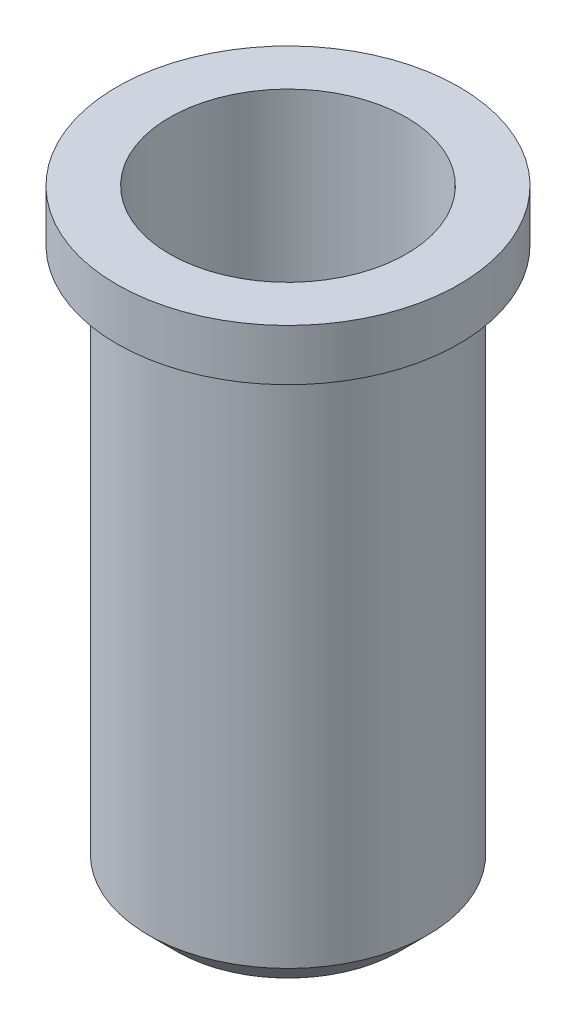
ISO-10303-21;
HEADER;
FILE_DESCRIPTION(('STEP AP214'),'2;1');
FILE_NAME('part.step','',(''),(''),'','','');
FILE_SCHEMA(('AUTOMOTIVE_DESIGN { 1 0 10303 214 1 1 1 1 }'));
ENDSEC;
DATA;
#1=APPLICATION_CONTEXT('core data for automotive mechanical design processes');
#2=APPLICATION_PROTOCOL_DEFINITION('international standard','automotive_design',2000,#1);
#3=PRODUCT_CONTEXT('',#1,'mechanical');
#4=PRODUCT('Part','Part','',(#3));
#5=PRODUCT_RELATED_PRODUCT_CATEGORY('part','',(#4));
#6=PRODUCT_DEFINITION_FORMATION('','',#4);
#7=PRODUCT_DEFINITION_CONTEXT('part definition',#1,'design');
#8=PRODUCT_DEFINITION('design','',#6,#7);
#9=PRODUCT_DEFINITION_SHAPE('','',#8);
#10=(LENGTH_UNIT() NAMED_UNIT(*) SI_UNIT(.MILLI.,.METRE.));
#11=(NAMED_UNIT(*) PLANE_ANGLE_UNIT() SI_UNIT($,.RADIAN.));
#12=(NAMED_UNIT(*) SI_UNIT($,.STERADIAN.) SOLID_ANGLE_UNIT());
#13=UNCERTAINTY_MEASURE_WITH_UNIT(LENGTH_MEASURE(1.E-05),#10,'distance_accuracy_value','');
#14=(GEOMETRIC_REPRESENTATION_CONTEXT(3) GLOBAL_UNCERTAINTY_ASSIGNED_CONTEXT((#13)) GLOBAL_UNIT_ASSIGNED_CONTEXT((#10,
#11,#12)) REPRESENTATION_CONTEXT('',''));
#15=CARTESIAN_POINT('',(0.,0.,0.));
#16=DIRECTION('',(0.,0.,1.));
#17=DIRECTION('',(1.,0.,0.));
#18=AXIS2_PLACEMENT_3D('',#15,#16,#17);
#19=CARTESIAN_POINT('',(0.,0.,0.));
#20=DIRECTION('',(0.,-1.,0.));
#21=DIRECTION('',(0.,0.,-1.));
#22=AXIS2_PLACEMENT_3D('',#19,#20,#21);
#23=CYLINDRICAL_SURFACE('',#22,1.0541);
#24=CARTESIAN_POINT('',(0.,0.8382,0.));
#25=DIRECTION('',(0.,-1.,0.));
#26=DIRECTION('',(0.,0.,-1.));
#27=AXIS2_PLACEMENT_3D('',#24,#25,#26);
#28=CIRCLE('',#27,1.0541);
#29=CARTESIAN_POINT('',(0.,0.8382,-1.0541));
#30=VERTEX_POINT('',#29);
#31=EDGE_CURVE('E11',#30,#30,#28,.T.);
#32=ORIENTED_EDGE('',*,*,#31,.T.);
#33=EDGE_LOOP('',(#32));
#34=FACE_BOUND('',#33,.T.);
#35=CARTESIAN_POINT('',(0.,5.4102,0.));
#36=DIRECTION('',(0.,-1.,0.));
#37=DIRECTION('',(0.,0.,-1.));
#38=AXIS2_PLACEMENT_3D('',#35,#36,#37);
#39=CIRCLE('',#38,1.0541);
#40=CARTESIAN_POINT('',(0.,5.4102,-1.0541));
#41=VERTEX_POINT('',#40);
#42=EDGE_CURVE('E53',#41,#41,#39,.T.);
#43=ORIENTED_EDGE('',*,*,#42,.F.);
#44=EDGE_LOOP('',(#43));
#45=FACE_BOUND('',#44,.T.);
#46=ADVANCED_FACE('F34',(#34,#45),#23,.F.);
#47=CARTESIAN_POINT('',(0.,0.8382,0.));
#48=DIRECTION('',(0.,1.,0.));
#49=DIRECTION('',(0.,0.,1.));
#50=AXIS2_PLACEMENT_3D('',#47,#48,#49);
#51=CONICAL_SURFACE('',#50,1.0541,1.06472136349856);
#52=CARTESIAN_POINT('',(0.,0.254,0.));
#53=VERTEX_POINT('',#52);
#54=VERTEX_LOOP('',#53);
#55=FACE_BOUND('',#54,.T.);
#56=ORIENTED_EDGE('',*,*,#31,.F.);
#57=EDGE_LOOP('',(#56));
#58=FACE_BOUND('',#57,.T.);
#59=ADVANCED_FACE('F43',(#55,#58),#51,.F.);
#60=CARTESIAN_POINT('',(0.,0.,0.));
#61=DIRECTION('',(0.,-1.,0.));
#62=DIRECTION('',(0.,0.,-1.));
#63=AXIS2_PLACEMENT_3D('',#60,#61,#62);
#64=PLANE('',#63);
#65=CARTESIAN_POINT('',(0.,0.,0.));
#66=DIRECTION('',(0.,-1.,0.));
#67=DIRECTION('',(0.,0.,-1.));
#68=AXIS2_PLACEMENT_3D('',#65,#66,#67);
#69=CIRCLE('',#68,0.9906);
#70=CARTESIAN_POINT('',(0.,0.,-0.9906));
#71=VERTEX_POINT('',#70);
#72=EDGE_CURVE('E40',#71,#71,#69,.T.);
#73=ORIENTED_EDGE('',*,*,#72,.T.);
#74=EDGE_LOOP('',(#73));
#75=FACE_BOUND('',#74,.T.);
#76=ADVANCED_FACE('F46',(#75),#64,.T.);
#77=CARTESIAN_POINT('',(0.,0.254,0.));
#78=DIRECTION('',(0.,1.,0.));
#79=DIRECTION('',(0.,0.,1.));
#80=AXIS2_PLACEMENT_3D('',#77,#78,#79);
#81=CONICAL_SURFACE('',#80,1.2446,0.785398163397449);
#82=ORIENTED_EDGE('',*,*,#72,.F.);
#83=EDGE_LOOP('',(#82));
#84=FACE_BOUND('',#83,.T.);
#85=CARTESIAN_POINT('',(0.,0.254,0.));
#86=DIRECTION('',(0.,-1.,0.));
#87=DIRECTION('',(0.,0.,-1.));
#88=AXIS2_PLACEMENT_3D('',#85,#86,#87);
#89=CIRCLE('',#88,1.2446);
#90=CARTESIAN_POINT('',(0.,0.254,-1.2446));
#91=VERTEX_POINT('',#90);
#92=EDGE_CURVE('E66',#91,#91,#89,.T.);
#93=ORIENTED_EDGE('',*,*,#92,.T.);
#94=EDGE_LOOP('',(#93));
#95=FACE_BOUND('',#94,.T.);
#96=ADVANCED_FACE('F72',(#84,#95),#81,.T.);
#97=CARTESIAN_POINT('',(0.,0.,0.));
#98=DIRECTION('',(0.,-1.,0.));
#99=DIRECTION('',(0.,0.,-1.));
#100=AXIS2_PLACEMENT_3D('',#97,#98,#99);
#101=CYLINDRICAL_SURFACE('',#100,1.2446);
#102=CARTESIAN_POINT('',(0.,4.953,0.));
#103=DIRECTION('',(0.,-1.,0.));
#104=DIRECTION('',(0.,0.,-1.));
#105=AXIS2_PLACEMENT_3D('',#102,#103,#104);
#106=CIRCLE('',#105,1.2446);
#107=CARTESIAN_POINT('',(0.,4.953,-1.2446));
#108=VERTEX_POINT('',#107);
#109=EDGE_CURVE('E63',#108,#108,#106,.T.);
#110=ORIENTED_EDGE('',*,*,#109,.T.);
#111=EDGE_LOOP('',(#110));
#112=FACE_BOUND('',#111,.T.);
#113=ORIENTED_EDGE('',*,*,#92,.F.);
#114=EDGE_LOOP('',(#113));
#115=FACE_BOUND('',#114,.T.);
#116=ADVANCED_FACE('F75',(#112,#115),#101,.T.);
#117=CARTESIAN_POINT('',(0.,4.953,0.));
#118=DIRECTION('',(0.,-1.,0.));
#119=DIRECTION('',(0.,0.,-1.));
#120=AXIS2_PLACEMENT_3D('',#117,#118,#119);
#121=PLANE('',#120);
#122=CARTESIAN_POINT('',(0.,4.953,0.));
#123=DIRECTION('',(0.,-1.,0.));
#124=DIRECTION('',(0.,0.,-1.));
#125=AXIS2_PLACEMENT_3D('',#122,#123,#124);
#126=CIRCLE('',#125,1.524);
#127=CARTESIAN_POINT('',(0.,4.953,-1.524));
#128=VERTEX_POINT('',#127);
#129=EDGE_CURVE('E58',#128,#128,#126,.T.);
#130=ORIENTED_EDGE('',*,*,#129,.T.);
#131=EDGE_LOOP('',(#130));
#132=FACE_BOUND('',#131,.T.);
#133=ORIENTED_EDGE('',*,*,#109,.F.);
#134=EDGE_LOOP('',(#133));
#135=FACE_BOUND('',#134,.T.);
#136=ADVANCED_FACE('F80',(#132,#135),#121,.T.);
#137=CARTESIAN_POINT('',(0.,0.,0.));
#138=DIRECTION('',(0.,-1.,0.));
#139=DIRECTION('',(0.,0.,-1.));
#140=AXIS2_PLACEMENT_3D('',#137,#138,#139);
#141=CYLINDRICAL_SURFACE('',#140,1.524);
#142=ORIENTED_EDGE('',*,*,#129,.F.);
#143=EDGE_LOOP('',(#142));
#144=FACE_BOUND('',#143,.T.);
#145=CARTESIAN_POINT('',(0.,5.4102,0.));
#146=DIRECTION('',(0.,-1.,0.));
#147=DIRECTION('',(0.,0.,-1.));
#148=AXIS2_PLACEMENT_3D('',#145,#146,#147);
#149=CIRCLE('',#148,1.524);
#150=CARTESIAN_POINT('',(0.,5.4102,-1.524));
#151=VERTEX_POINT('',#150);
#152=EDGE_CURVE('E55',#151,#151,#149,.T.);
#153=ORIENTED_EDGE('',*,*,#152,.T.);
#154=EDGE_LOOP('',(#153));
#155=FACE_BOUND('',#154,.T.);
#156=ADVANCED_FACE('F86',(#144,#155),#141,.T.);
#157=CARTESIAN_POINT('',(0.,5.4102,0.));
#158=DIRECTION('',(0.,-1.,0.));
#159=DIRECTION('',(0.,0.,-1.));
#160=AXIS2_PLACEMENT_3D('',#157,#158,#159);
#161=PLANE('',#160);
#162=ORIENTED_EDGE('',*,*,#152,.F.);
#163=EDGE_LOOP('',(#162));
#164=FACE_BOUND('',#163,.T.);
#165=ORIENTED_EDGE('',*,*,#42,.T.);
#166=EDGE_LOOP('',(#165));
#167=FACE_BOUND('',#166,.T.);
#168=ADVANCED_FACE('F119',(#164,#167),#161,.F.);
#169=CLOSED_SHELL('',(#46,#59,#76,#96,#116,#136,#156,#168));
#170=MANIFOLD_SOLID_BREP('B2',#169);
#171=ADVANCED_BREP_SHAPE_REPRESENTATION('',(#18,#170),#14);
#172=SHAPE_DEFINITION_REPRESENTATION(#9,#171);
ENDSEC;
END-ISO-10303-21;
